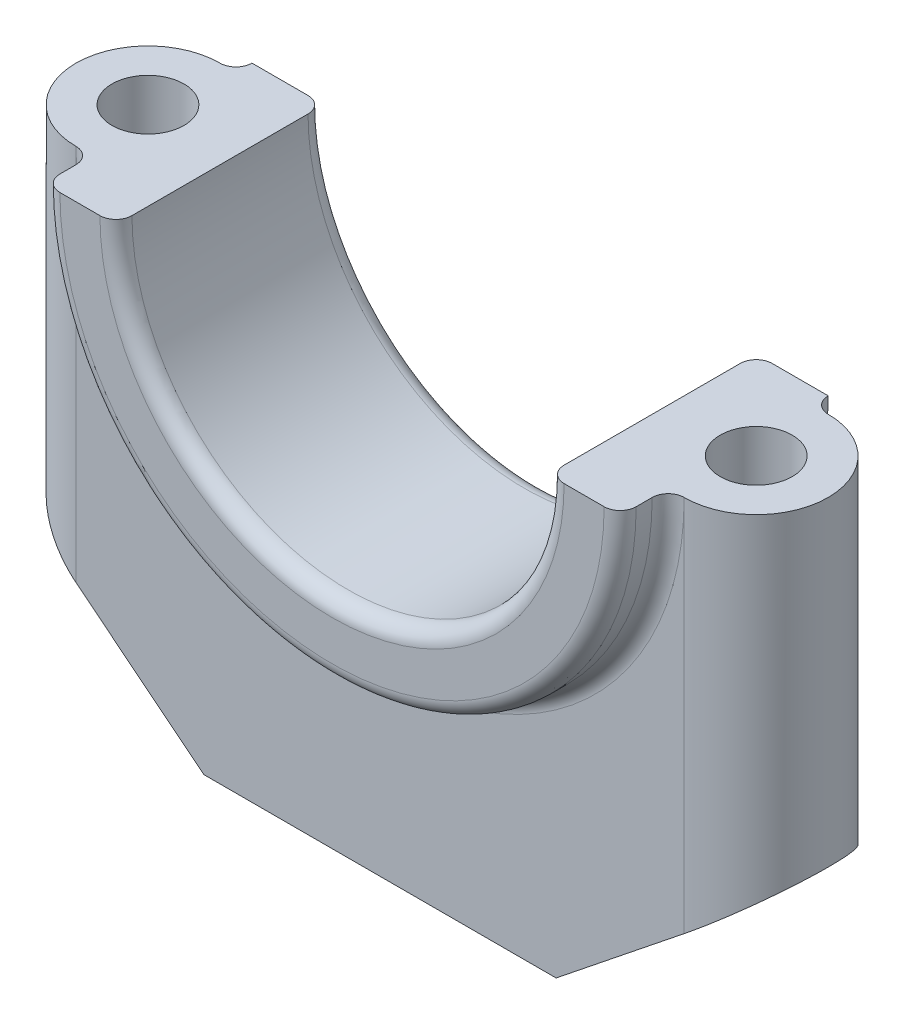
ISO-10303-21;
HEADER;
FILE_DESCRIPTION(('STEP AP214'),'2;1');
FILE_NAME('part.step','',(''),(''),'','','');
FILE_SCHEMA(('AUTOMOTIVE_DESIGN { 1 0 10303 214 1 1 1 1 }'));
ENDSEC;
DATA;
#1=APPLICATION_CONTEXT('core data for automotive mechanical design processes');
#2=APPLICATION_PROTOCOL_DEFINITION('international standard','automotive_design',2000,#1);
#3=PRODUCT_CONTEXT('',#1,'mechanical');
#4=PRODUCT('Part','Part','',(#3));
#5=PRODUCT_RELATED_PRODUCT_CATEGORY('part','',(#4));
#6=PRODUCT_DEFINITION_FORMATION('','',#4);
#7=PRODUCT_DEFINITION_CONTEXT('part definition',#1,'design');
#8=PRODUCT_DEFINITION('design','',#6,#7);
#9=PRODUCT_DEFINITION_SHAPE('','',#8);
#10=(LENGTH_UNIT() NAMED_UNIT(*) SI_UNIT(.MILLI.,.METRE.));
#11=(NAMED_UNIT(*) PLANE_ANGLE_UNIT() SI_UNIT($,.RADIAN.));
#12=(NAMED_UNIT(*) SI_UNIT($,.STERADIAN.) SOLID_ANGLE_UNIT());
#13=UNCERTAINTY_MEASURE_WITH_UNIT(LENGTH_MEASURE(1.E-05),#10,'distance_accuracy_value','');
#14=(GEOMETRIC_REPRESENTATION_CONTEXT(3) GLOBAL_UNCERTAINTY_ASSIGNED_CONTEXT((#13)) GLOBAL_UNIT_ASSIGNED_CONTEXT((#10,
#11,#12)) REPRESENTATION_CONTEXT('',''));
#15=CARTESIAN_POINT('',(0.,0.,0.));
#16=DIRECTION('',(0.,0.,1.));
#17=DIRECTION('',(1.,0.,0.));
#18=AXIS2_PLACEMENT_3D('',#15,#16,#17);
#19=CARTESIAN_POINT('',(-38.,0.,0.));
#20=DIRECTION('',(0.,-1.,0.));
#21=DIRECTION('',(1.,0.,0.));
#22=AXIS2_PLACEMENT_3D('',#19,#20,#21);
#23=CYLINDRICAL_SURFACE('',#22,9.);
#24=DIRECTION('',(0.,1.,0.));
#25=VECTOR('',#24,1.);
#26=CARTESIAN_POINT('',(-38.,0.,9.));
#27=LINE('',#26,#25);
#28=CARTESIAN_POINT('',(-38.,0.,9.));
#29=VERTEX_POINT('',#28);
#30=CARTESIAN_POINT('',(-38.,-47.2,9.));
#31=VERTEX_POINT('',#30);
#32=EDGE_CURVE('E154',#29,#31,#27,.F.);
#33=ORIENTED_EDGE('',*,*,#32,.F.);
#34=CARTESIAN_POINT('',(-38.,0.,0.));
#35=DIRECTION('',(0.,-1.,0.));
#36=DIRECTION('',(0.,0.,-1.));
#37=AXIS2_PLACEMENT_3D('',#34,#35,#36);
#38=CIRCLE('',#37,9.);
#39=CARTESIAN_POINT('',(-38.,0.,-9.));
#40=VERTEX_POINT('',#39);
#41=EDGE_CURVE('E216',#40,#29,#38,.F.);
#42=ORIENTED_EDGE('',*,*,#41,.F.);
#43=DIRECTION('',(0.,-1.,0.));
#44=VECTOR('',#43,1.);
#45=CARTESIAN_POINT('',(-38.,0.,-9.));
#46=LINE('',#45,#44);
#47=CARTESIAN_POINT('',(-38.,-47.2,-9.));
#48=VERTEX_POINT('',#47);
#49=EDGE_CURVE('E213',#48,#40,#46,.F.);
#50=ORIENTED_EDGE('',*,*,#49,.F.);
#51=CARTESIAN_POINT('',(-38.,-47.2,0.));
#52=DIRECTION('',(0.624695047554424,0.78086880944303,0.));
#53=DIRECTION('',(0.78086880944303,-0.624695047554424,0.));
#54=AXIS2_PLACEMENT_3D('',#51,#52,#53);
#55=ELLIPSE('',#54,11.5256236273791,9.);
#56=EDGE_CURVE('E219',#31,#48,#55,.F.);
#57=ORIENTED_EDGE('',*,*,#56,.F.);
#58=EDGE_LOOP('',(#33,#42,#50,#57));
#59=FACE_BOUND('',#58,.T.);
#60=ADVANCED_FACE('F40',(#59),#23,.T.);
#61=CARTESIAN_POINT('',(38.,0.,0.));
#62=DIRECTION('',(0.,-1.,0.));
#63=DIRECTION('',(1.,0.,0.));
#64=AXIS2_PLACEMENT_3D('',#61,#62,#63);
#65=CYLINDRICAL_SURFACE('',#64,9.);
#66=DIRECTION('',(0.,1.,0.));
#67=VECTOR('',#66,1.);
#68=CARTESIAN_POINT('',(38.,0.,-9.));
#69=LINE('',#68,#67);
#70=CARTESIAN_POINT('',(38.,0.,-9.));
#71=VERTEX_POINT('',#70);
#72=CARTESIAN_POINT('',(38.,-47.2,-9.));
#73=VERTEX_POINT('',#72);
#74=EDGE_CURVE('E193',#71,#73,#69,.F.);
#75=ORIENTED_EDGE('',*,*,#74,.F.);
#76=CARTESIAN_POINT('',(38.,0.,0.));
#77=DIRECTION('',(0.,-1.,0.));
#78=DIRECTION('',(0.,0.,-1.));
#79=AXIS2_PLACEMENT_3D('',#76,#77,#78);
#80=CIRCLE('',#79,9.);
#81=CARTESIAN_POINT('',(38.,0.,9.));
#82=VERTEX_POINT('',#81);
#83=EDGE_CURVE('E207',#82,#71,#80,.F.);
#84=ORIENTED_EDGE('',*,*,#83,.F.);
#85=DIRECTION('',(0.,-1.,0.));
#86=VECTOR('',#85,1.);
#87=CARTESIAN_POINT('',(38.,0.,9.));
#88=LINE('',#87,#86);
#89=CARTESIAN_POINT('',(38.,-47.2,9.));
#90=VERTEX_POINT('',#89);
#91=EDGE_CURVE('E205',#90,#82,#88,.F.);
#92=ORIENTED_EDGE('',*,*,#91,.F.);
#93=CARTESIAN_POINT('',(38.,-47.2,0.));
#94=DIRECTION('',(0.624695047554424,-0.78086880944303,0.));
#95=DIRECTION('',(-0.78086880944303,-0.624695047554424,0.));
#96=AXIS2_PLACEMENT_3D('',#93,#94,#95);
#97=ELLIPSE('',#96,11.5256236273791,9.);
#98=EDGE_CURVE('E210',#73,#90,#97,.T.);
#99=ORIENTED_EDGE('',*,*,#98,.F.);
#100=EDGE_LOOP('',(#75,#84,#92,#99));
#101=FACE_BOUND('',#100,.T.);
#102=ADVANCED_FACE('F294',(#101),#65,.T.);
#103=CARTESIAN_POINT('',(0.,0.,-11.));
#104=DIRECTION('',(0.,-1.,0.));
#105=DIRECTION('',(0.,0.,-1.));
#106=AXIS2_PLACEMENT_3D('',#103,#104,#105);
#107=PLANE('',#106);
#108=CARTESIAN_POINT('',(-38.,0.,0.));
#109=DIRECTION('',(0.,1.,0.));
#110=DIRECTION('',(0.,0.,-1.));
#111=AXIS2_PLACEMENT_3D('',#108,#109,#110);
#112=CIRCLE('',#111,4.5);
#113=CARTESIAN_POINT('',(-38.,0.,-4.5));
#114=VERTEX_POINT('',#113);
#115=EDGE_CURVE('E485',#114,#114,#112,.T.);
#116=ORIENTED_EDGE('',*,*,#115,.F.);
#117=EDGE_LOOP('',(#116));
#118=FACE_BOUND('',#117,.T.);
#119=DIRECTION('',(1.,0.,0.));
#120=VECTOR('',#119,1.);
#121=CARTESIAN_POINT('',(0.,0.,15.));
#122=LINE('',#121,#120);
#123=CARTESIAN_POINT('',(-34.,0.,15.));
#124=VERTEX_POINT('',#123);
#125=CARTESIAN_POINT('',(-29.,0.,15.));
#126=VERTEX_POINT('',#125);
#127=EDGE_CURVE('E166',#124,#126,#122,.T.);
#128=ORIENTED_EDGE('',*,*,#127,.T.);
#129=CARTESIAN_POINT('',(-29.,0.,13.));
#130=DIRECTION('',(0.,-1.,0.));
#131=DIRECTION('',(0.,0.,-1.));
#132=AXIS2_PLACEMENT_3D('',#129,#130,#131);
#133=CIRCLE('',#132,2.);
#134=CARTESIAN_POINT('',(-27.,0.,13.));
#135=VERTEX_POINT('',#134);
#136=EDGE_CURVE('E48',#126,#135,#133,.F.);
#137=ORIENTED_EDGE('',*,*,#136,.T.);
#138=DIRECTION('',(0.,0.,1.));
#139=VECTOR('',#138,1.);
#140=CARTESIAN_POINT('',(-27.,0.,-11.));
#141=LINE('',#140,#139);
#142=CARTESIAN_POINT('',(-27.,0.,-9.));
#143=VERTEX_POINT('',#142);
#144=EDGE_CURVE('E190',#143,#135,#141,.T.);
#145=ORIENTED_EDGE('',*,*,#144,.F.);
#146=CARTESIAN_POINT('',(-29.,0.,-9.));
#147=DIRECTION('',(0.,-1.,0.));
#148=DIRECTION('',(0.,0.,-1.));
#149=AXIS2_PLACEMENT_3D('',#146,#147,#148);
#150=CIRCLE('',#149,2.);
#151=CARTESIAN_POINT('',(-29.,0.,-11.));
#152=VERTEX_POINT('',#151);
#153=EDGE_CURVE('E55',#143,#152,#150,.F.);
#154=ORIENTED_EDGE('',*,*,#153,.T.);
#155=DIRECTION('',(1.,0.,0.));
#156=VECTOR('',#155,1.);
#157=CARTESIAN_POINT('',(0.,0.,-11.));
#158=LINE('',#157,#156);
#159=CARTESIAN_POINT('',(-36.,0.,-11.));
#160=VERTEX_POINT('',#159);
#161=EDGE_CURVE('E184',#160,#152,#158,.T.);
#162=ORIENTED_EDGE('',*,*,#161,.F.);
#163=CARTESIAN_POINT('',(-38.,0.,-11.));
#164=DIRECTION('',(0.,-1.,0.));
#165=DIRECTION('',(0.,0.,-1.));
#166=AXIS2_PLACEMENT_3D('',#163,#164,#165);
#167=CIRCLE('',#166,2.);
#168=EDGE_CURVE('E247',#160,#40,#167,.T.);
#169=ORIENTED_EDGE('',*,*,#168,.T.);
#170=ORIENTED_EDGE('',*,*,#41,.T.);
#171=CARTESIAN_POINT('',(-38.,0.,11.));
#172=DIRECTION('',(0.,-1.,0.));
#173=DIRECTION('',(0.,0.,-1.));
#174=AXIS2_PLACEMENT_3D('',#171,#172,#173);
#175=CIRCLE('',#174,2.);
#176=CARTESIAN_POINT('',(-36.,0.,11.));
#177=VERTEX_POINT('',#176);
#178=EDGE_CURVE('E251',#29,#177,#175,.T.);
#179=ORIENTED_EDGE('',*,*,#178,.T.);
#180=DIRECTION('',(0.,0.,1.));
#181=VECTOR('',#180,1.);
#182=CARTESIAN_POINT('',(-36.,0.,-11.));
#183=LINE('',#182,#181);
#184=CARTESIAN_POINT('',(-36.,0.,13.));
#185=VERTEX_POINT('',#184);
#186=EDGE_CURVE('E200',#177,#185,#183,.T.);
#187=ORIENTED_EDGE('',*,*,#186,.T.);
#188=CARTESIAN_POINT('',(-34.,0.,13.));
#189=DIRECTION('',(0.,-1.,0.));
#190=DIRECTION('',(0.,0.,-1.));
#191=AXIS2_PLACEMENT_3D('',#188,#189,#190);
#192=CIRCLE('',#191,2.);
#193=EDGE_CURVE('E237',#185,#124,#192,.F.);
#194=ORIENTED_EDGE('',*,*,#193,.T.);
#195=EDGE_LOOP('',(#128,#137,#145,#154,#162,#169,#170,#179,#187,#194));
#196=FACE_BOUND('',#195,.T.);
#197=ADVANCED_FACE('F264',(#118,#196),#107,.F.);
#198=CARTESIAN_POINT('',(0.,0.,-11.));
#199=DIRECTION('',(0.,0.,1.));
#200=DIRECTION('',(1.,0.,0.));
#201=AXIS2_PLACEMENT_3D('',#198,#199,#200);
#202=CYLINDRICAL_SURFACE('',#201,27.);
#203=ORIENTED_EDGE('',*,*,#144,.T.);
#204=CARTESIAN_POINT('',(0.,0.,13.));
#205=DIRECTION('',(0.,0.,1.));
#206=DIRECTION('',(1.,0.,0.));
#207=AXIS2_PLACEMENT_3D('',#204,#205,#206);
#208=CIRCLE('',#207,27.);
#209=CARTESIAN_POINT('',(27.,0.,13.));
#210=VERTEX_POINT('',#209);
#211=EDGE_CURVE('E255',#135,#210,#208,.T.);
#212=ORIENTED_EDGE('',*,*,#211,.T.);
#213=DIRECTION('',(0.,0.,1.));
#214=VECTOR('',#213,1.);
#215=CARTESIAN_POINT('',(27.,0.,-11.));
#216=LINE('',#215,#214);
#217=CARTESIAN_POINT('',(27.,0.,-9.));
#218=VERTEX_POINT('',#217);
#219=EDGE_CURVE('E194',#218,#210,#216,.T.);
#220=ORIENTED_EDGE('',*,*,#219,.F.);
#221=CARTESIAN_POINT('',(0.,0.,-9.));
#222=DIRECTION('',(0.,0.,1.));
#223=DIRECTION('',(1.,0.,0.));
#224=AXIS2_PLACEMENT_3D('',#221,#222,#223);
#225=CIRCLE('',#224,27.);
#226=EDGE_CURVE('E253',#218,#143,#225,.F.);
#227=ORIENTED_EDGE('',*,*,#226,.T.);
#228=EDGE_LOOP('',(#203,#212,#220,#227));
#229=FACE_BOUND('',#228,.T.);
#230=ADVANCED_FACE('F268',(#229),#202,.F.);
#231=CARTESIAN_POINT('',(38.,0.,0.));
#232=DIRECTION('',(0.,1.,0.));
#233=DIRECTION('',(0.,0.,1.));
#234=AXIS2_PLACEMENT_3D('',#231,#232,#233);
#235=CIRCLE('',#234,4.5);
#236=CARTESIAN_POINT('',(38.,0.,4.5));
#237=VERTEX_POINT('',#236);
#238=EDGE_CURVE('E225',#237,#237,#235,.T.);
#239=ORIENTED_EDGE('',*,*,#238,.F.);
#240=EDGE_LOOP('',(#239));
#241=FACE_BOUND('',#240,.T.);
#242=ORIENTED_EDGE('',*,*,#219,.T.);
#243=CARTESIAN_POINT('',(29.,0.,13.));
#244=DIRECTION('',(0.,-1.,0.));
#245=DIRECTION('',(0.,0.,-1.));
#246=AXIS2_PLACEMENT_3D('',#243,#244,#245);
#247=CIRCLE('',#246,2.);
#248=CARTESIAN_POINT('',(29.,0.,15.));
#249=VERTEX_POINT('',#248);
#250=EDGE_CURVE('E260',#210,#249,#247,.F.);
#251=ORIENTED_EDGE('',*,*,#250,.T.);
#252=CARTESIAN_POINT('',(34.,0.,15.));
#253=VERTEX_POINT('',#252);
#254=EDGE_CURVE('E183',#249,#253,#122,.T.);
#255=ORIENTED_EDGE('',*,*,#254,.T.);
#256=CARTESIAN_POINT('',(34.,0.,13.));
#257=DIRECTION('',(0.,-1.,0.));
#258=DIRECTION('',(0.,0.,-1.));
#259=AXIS2_PLACEMENT_3D('',#256,#257,#258);
#260=CIRCLE('',#259,2.);
#261=CARTESIAN_POINT('',(36.,0.,13.));
#262=VERTEX_POINT('',#261);
#263=EDGE_CURVE('E230',#253,#262,#260,.F.);
#264=ORIENTED_EDGE('',*,*,#263,.T.);
#265=DIRECTION('',(0.,0.,1.));
#266=VECTOR('',#265,1.);
#267=CARTESIAN_POINT('',(36.,0.,-11.));
#268=LINE('',#267,#266);
#269=CARTESIAN_POINT('',(36.,0.,11.));
#270=VERTEX_POINT('',#269);
#271=EDGE_CURVE('E197',#270,#262,#268,.T.);
#272=ORIENTED_EDGE('',*,*,#271,.F.);
#273=CARTESIAN_POINT('',(38.,0.,11.));
#274=DIRECTION('',(0.,-1.,0.));
#275=DIRECTION('',(0.,0.,-1.));
#276=AXIS2_PLACEMENT_3D('',#273,#274,#275);
#277=CIRCLE('',#276,2.);
#278=EDGE_CURVE('E249',#270,#82,#277,.T.);
#279=ORIENTED_EDGE('',*,*,#278,.T.);
#280=ORIENTED_EDGE('',*,*,#83,.T.);
#281=CARTESIAN_POINT('',(38.,0.,-11.));
#282=DIRECTION('',(0.,-1.,0.));
#283=DIRECTION('',(0.,0.,-1.));
#284=AXIS2_PLACEMENT_3D('',#281,#282,#283);
#285=CIRCLE('',#284,2.);
#286=CARTESIAN_POINT('',(36.,0.,-11.));
#287=VERTEX_POINT('',#286);
#288=EDGE_CURVE('E244',#71,#287,#285,.T.);
#289=ORIENTED_EDGE('',*,*,#288,.T.);
#290=CARTESIAN_POINT('',(29.,0.,-11.));
#291=VERTEX_POINT('',#290);
#292=EDGE_CURVE('E187',#291,#287,#158,.T.);
#293=ORIENTED_EDGE('',*,*,#292,.F.);
#294=CARTESIAN_POINT('',(29.,0.,-9.));
#295=DIRECTION('',(0.,-1.,0.));
#296=DIRECTION('',(0.,0.,-1.));
#297=AXIS2_PLACEMENT_3D('',#294,#295,#296);
#298=CIRCLE('',#297,2.);
#299=EDGE_CURVE('E258',#291,#218,#298,.F.);
#300=ORIENTED_EDGE('',*,*,#299,.T.);
#301=EDGE_LOOP('',(#242,#251,#255,#264,#272,#279,#280,#289,#293,#300));
#302=FACE_BOUND('',#301,.T.);
#303=ADVANCED_FACE('F273',(#241,#302),#107,.F.);
#304=CARTESIAN_POINT('',(0.,0.,-11.));
#305=DIRECTION('',(0.,0.,1.));
#306=DIRECTION('',(1.,0.,0.));
#307=AXIS2_PLACEMENT_3D('',#304,#305,#306);
#308=CYLINDRICAL_SURFACE('',#307,36.);
#309=ORIENTED_EDGE('',*,*,#271,.T.);
#310=CARTESIAN_POINT('',(0.,0.,13.));
#311=DIRECTION('',(0.,0.,1.));
#312=DIRECTION('',(1.,0.,0.));
#313=AXIS2_PLACEMENT_3D('',#310,#311,#312);
#314=CIRCLE('',#313,36.);
#315=EDGE_CURVE('E235',#262,#185,#314,.F.);
#316=ORIENTED_EDGE('',*,*,#315,.T.);
#317=ORIENTED_EDGE('',*,*,#186,.F.);
#318=CARTESIAN_POINT('',(0.,0.,11.));
#319=DIRECTION('',(0.,0.,1.));
#320=DIRECTION('',(1.,0.,0.));
#321=AXIS2_PLACEMENT_3D('',#318,#319,#320);
#322=CIRCLE('',#321,36.);
#323=EDGE_CURVE('E232',#177,#270,#322,.T.);
#324=ORIENTED_EDGE('',*,*,#323,.T.);
#325=EDGE_LOOP('',(#309,#316,#317,#324));
#326=FACE_BOUND('',#325,.T.);
#327=ADVANCED_FACE('F283',(#326),#308,.T.);
#328=CARTESIAN_POINT('',(0.,0.,-11.));
#329=DIRECTION('',(0.,0.,1.));
#330=DIRECTION('',(1.,0.,0.));
#331=AXIS2_PLACEMENT_3D('',#328,#329,#330);
#332=PLANE('',#331);
#333=ORIENTED_EDGE('',*,*,#161,.T.);
#334=CARTESIAN_POINT('',(0.,0.,-11.));
#335=DIRECTION('',(0.,0.,1.));
#336=DIRECTION('',(1.,0.,0.));
#337=AXIS2_PLACEMENT_3D('',#334,#335,#336);
#338=CIRCLE('',#337,29.);
#339=EDGE_CURVE('E11',#152,#291,#338,.T.);
#340=ORIENTED_EDGE('',*,*,#339,.T.);
#341=ORIENTED_EDGE('',*,*,#292,.T.);
#342=CARTESIAN_POINT('',(0.,0.,-11.));
#343=DIRECTION('',(0.,0.,1.));
#344=DIRECTION('',(1.,0.,0.));
#345=AXIS2_PLACEMENT_3D('',#342,#343,#344);
#346=CIRCLE('',#345,36.);
#347=EDGE_CURVE('E186',#160,#287,#346,.T.);
#348=ORIENTED_EDGE('',*,*,#347,.F.);
#349=EDGE_LOOP('',(#333,#340,#341,#348));
#350=FACE_BOUND('',#349,.T.);
#351=ADVANCED_FACE('F308',(#350),#332,.F.);
#352=CARTESIAN_POINT('',(0.,0.,15.));
#353=DIRECTION('',(0.,0.,1.));
#354=DIRECTION('',(1.,0.,0.));
#355=AXIS2_PLACEMENT_3D('',#352,#353,#354);
#356=PLANE('',#355);
#357=ORIENTED_EDGE('',*,*,#254,.F.);
#358=CARTESIAN_POINT('',(0.,0.,15.));
#359=DIRECTION('',(0.,0.,1.));
#360=DIRECTION('',(1.,0.,0.));
#361=AXIS2_PLACEMENT_3D('',#358,#359,#360);
#362=CIRCLE('',#361,29.);
#363=EDGE_CURVE('E63',#249,#126,#362,.F.);
#364=ORIENTED_EDGE('',*,*,#363,.T.);
#365=ORIENTED_EDGE('',*,*,#127,.F.);
#366=CARTESIAN_POINT('',(0.,0.,15.));
#367=DIRECTION('',(0.,0.,1.));
#368=DIRECTION('',(1.,0.,0.));
#369=AXIS2_PLACEMENT_3D('',#366,#367,#368);
#370=CIRCLE('',#369,34.);
#371=EDGE_CURVE('E221',#124,#253,#370,.T.);
#372=ORIENTED_EDGE('',*,*,#371,.T.);
#373=EDGE_LOOP('',(#357,#364,#365,#372));
#374=FACE_BOUND('',#373,.T.);
#375=ADVANCED_FACE('F275',(#374),#356,.T.);
#376=CARTESIAN_POINT('',(-37.8536585365854,-47.3170731707317,9.));
#377=DIRECTION('',(0.624695047554424,0.78086880944303,0.));
#378=DIRECTION('',(-0.78086880944303,0.624695047554424,0.));
#379=AXIS2_PLACEMENT_3D('',#376,#377,#378);
#380=PLANE('',#379);
#381=CARTESIAN_POINT('',(-38.,-47.2,0.));
#382=DIRECTION('',(0.624695047554424,0.78086880944303,0.));
#383=DIRECTION('',(-0.78086880944303,0.624695047554424,0.));
#384=AXIS2_PLACEMENT_3D('',#381,#382,#383);
#385=ELLIPSE('',#384,5.76281181368956,4.5);
#386=CARTESIAN_POINT('',(-42.5,-43.6,0.));
#387=VERTEX_POINT('',#386);
#388=EDGE_CURVE('E178',#387,#387,#385,.T.);
#389=ORIENTED_EDGE('',*,*,#388,.T.);
#390=EDGE_LOOP('',(#389));
#391=FACE_BOUND('',#390,.T.);
#392=DIRECTION('',(0.78086880944303,-0.624695047554424,0.));
#393=VECTOR('',#392,1.);
#394=CARTESIAN_POINT('',(-37.8536585365854,-47.3170731707317,9.));
#395=LINE('',#394,#393);
#396=CARTESIAN_POINT('',(-22.,-60.,9.));
#397=VERTEX_POINT('',#396);
#398=EDGE_CURVE('E145',#31,#397,#395,.T.);
#399=ORIENTED_EDGE('',*,*,#398,.F.);
#400=ORIENTED_EDGE('',*,*,#56,.T.);
#401=DIRECTION('',(0.78086880944303,-0.624695047554424,0.));
#402=VECTOR('',#401,1.);
#403=CARTESIAN_POINT('',(-37.8536585365854,-47.3170731707317,-9.));
#404=LINE('',#403,#402);
#405=CARTESIAN_POINT('',(-22.,-60.,-9.));
#406=VERTEX_POINT('',#405);
#407=EDGE_CURVE('E162',#48,#406,#404,.T.);
#408=ORIENTED_EDGE('',*,*,#407,.T.);
#409=DIRECTION('',(0.,0.,-1.));
#410=VECTOR('',#409,1.);
#411=CARTESIAN_POINT('',(-22.,-60.,9.));
#412=LINE('',#411,#410);
#413=EDGE_CURVE('E159',#397,#406,#412,.T.);
#414=ORIENTED_EDGE('',*,*,#413,.F.);
#415=EDGE_LOOP('',(#399,#400,#408,#414));
#416=FACE_BOUND('',#415,.T.);
#417=ADVANCED_FACE('F160',(#391,#416),#380,.F.);
#418=CARTESIAN_POINT('',(0.,-60.,9.));
#419=DIRECTION('',(0.,1.,0.));
#420=DIRECTION('',(0.,0.,1.));
#421=AXIS2_PLACEMENT_3D('',#418,#419,#420);
#422=PLANE('',#421);
#423=DIRECTION('',(1.,0.,0.));
#424=VECTOR('',#423,1.);
#425=CARTESIAN_POINT('',(0.,-60.,-9.));
#426=LINE('',#425,#424);
#427=CARTESIAN_POINT('',(22.,-60.,-9.));
#428=VERTEX_POINT('',#427);
#429=EDGE_CURVE('E177',#406,#428,#426,.T.);
#430=ORIENTED_EDGE('',*,*,#429,.T.);
#431=DIRECTION('',(0.,0.,-1.));
#432=VECTOR('',#431,1.);
#433=CARTESIAN_POINT('',(22.,-60.,9.));
#434=LINE('',#433,#432);
#435=CARTESIAN_POINT('',(22.,-60.,9.));
#436=VERTEX_POINT('',#435);
#437=EDGE_CURVE('E167',#436,#428,#434,.T.);
#438=ORIENTED_EDGE('',*,*,#437,.F.);
#439=DIRECTION('',(1.,0.,0.));
#440=VECTOR('',#439,1.);
#441=CARTESIAN_POINT('',(0.,-60.,9.));
#442=LINE('',#441,#440);
#443=EDGE_CURVE('E151',#397,#436,#442,.T.);
#444=ORIENTED_EDGE('',*,*,#443,.F.);
#445=ORIENTED_EDGE('',*,*,#413,.T.);
#446=EDGE_LOOP('',(#430,#438,#444,#445));
#447=FACE_BOUND('',#446,.T.);
#448=ADVANCED_FACE('F169',(#447),#422,.F.);
#449=CARTESIAN_POINT('',(37.8536585365854,-47.3170731707317,9.));
#450=DIRECTION('',(0.624695047554424,-0.78086880944303,0.));
#451=DIRECTION('',(0.78086880944303,0.624695047554424,0.));
#452=AXIS2_PLACEMENT_3D('',#449,#450,#451);
#453=PLANE('',#452);
#454=CARTESIAN_POINT('',(38.,-47.2,0.));
#455=DIRECTION('',(0.624695047554424,-0.78086880944303,0.));
#456=DIRECTION('',(0.78086880944303,0.624695047554424,0.));
#457=AXIS2_PLACEMENT_3D('',#454,#455,#456);
#458=ELLIPSE('',#457,5.76281181368956,4.5);
#459=CARTESIAN_POINT('',(42.5,-43.6,0.));
#460=VERTEX_POINT('',#459);
#461=EDGE_CURVE('E222',#460,#460,#458,.T.);
#462=ORIENTED_EDGE('',*,*,#461,.F.);
#463=EDGE_LOOP('',(#462));
#464=FACE_BOUND('',#463,.T.);
#465=DIRECTION('',(-0.78086880944303,-0.624695047554424,0.));
#466=VECTOR('',#465,1.);
#467=CARTESIAN_POINT('',(37.8536585365854,-47.3170731707317,-9.));
#468=LINE('',#467,#466);
#469=EDGE_CURVE('E156',#73,#428,#468,.T.);
#470=ORIENTED_EDGE('',*,*,#469,.F.);
#471=ORIENTED_EDGE('',*,*,#98,.T.);
#472=DIRECTION('',(-0.78086880944303,-0.624695047554424,0.));
#473=VECTOR('',#472,1.);
#474=CARTESIAN_POINT('',(37.8536585365854,-47.3170731707317,9.));
#475=LINE('',#474,#473);
#476=EDGE_CURVE('E171',#90,#436,#475,.T.);
#477=ORIENTED_EDGE('',*,*,#476,.T.);
#478=ORIENTED_EDGE('',*,*,#437,.T.);
#479=EDGE_LOOP('',(#470,#471,#477,#478));
#480=FACE_BOUND('',#479,.T.);
#481=ADVANCED_FACE('F297',(#464,#480),#453,.T.);
#482=CARTESIAN_POINT('',(0.,0.,9.));
#483=DIRECTION('',(0.,0.,1.));
#484=DIRECTION('',(1.,0.,0.));
#485=AXIS2_PLACEMENT_3D('',#482,#483,#484);
#486=PLANE('',#485);
#487=ORIENTED_EDGE('',*,*,#91,.T.);
#488=CARTESIAN_POINT('',(0.,0.,9.));
#489=DIRECTION('',(0.,0.,1.));
#490=DIRECTION('',(1.,0.,0.));
#491=AXIS2_PLACEMENT_3D('',#488,#489,#490);
#492=CIRCLE('',#491,38.);
#493=EDGE_CURVE('E242',#82,#29,#492,.F.);
#494=ORIENTED_EDGE('',*,*,#493,.T.);
#495=ORIENTED_EDGE('',*,*,#32,.T.);
#496=ORIENTED_EDGE('',*,*,#398,.T.);
#497=ORIENTED_EDGE('',*,*,#443,.T.);
#498=ORIENTED_EDGE('',*,*,#476,.F.);
#499=EDGE_LOOP('',(#487,#494,#495,#496,#497,#498));
#500=FACE_BOUND('',#499,.T.);
#501=ADVANCED_FACE('F148',(#500),#486,.T.);
#502=CARTESIAN_POINT('',(0.,0.,-9.));
#503=DIRECTION('',(0.,0.,1.));
#504=DIRECTION('',(1.,0.,0.));
#505=AXIS2_PLACEMENT_3D('',#502,#503,#504);
#506=PLANE('',#505);
#507=ORIENTED_EDGE('',*,*,#49,.T.);
#508=CARTESIAN_POINT('',(0.,0.,-9.));
#509=DIRECTION('',(0.,0.,1.));
#510=DIRECTION('',(1.,0.,0.));
#511=AXIS2_PLACEMENT_3D('',#508,#509,#510);
#512=CIRCLE('',#511,38.);
#513=EDGE_CURVE('E239',#40,#71,#512,.T.);
#514=ORIENTED_EDGE('',*,*,#513,.T.);
#515=ORIENTED_EDGE('',*,*,#74,.T.);
#516=ORIENTED_EDGE('',*,*,#469,.T.);
#517=ORIENTED_EDGE('',*,*,#429,.F.);
#518=ORIENTED_EDGE('',*,*,#407,.F.);
#519=EDGE_LOOP('',(#507,#514,#515,#516,#517,#518));
#520=FACE_BOUND('',#519,.T.);
#521=ADVANCED_FACE('F299',(#520),#506,.F.);
#522=CARTESIAN_POINT('',(38.,-88.,0.));
#523=DIRECTION('',(0.,1.,0.));
#524=DIRECTION('',(0.,0.,1.));
#525=AXIS2_PLACEMENT_3D('',#522,#523,#524);
#526=CYLINDRICAL_SURFACE('',#525,4.5);
#527=ORIENTED_EDGE('',*,*,#461,.T.);
#528=EDGE_LOOP('',(#527));
#529=FACE_BOUND('',#528,.T.);
#530=ORIENTED_EDGE('',*,*,#238,.T.);
#531=EDGE_LOOP('',(#530));
#532=FACE_BOUND('',#531,.T.);
#533=ADVANCED_FACE('F426',(#529,#532),#526,.F.);
#534=CARTESIAN_POINT('',(-38.,-88.,0.));
#535=DIRECTION('',(0.,1.,0.));
#536=DIRECTION('',(0.,0.,1.));
#537=AXIS2_PLACEMENT_3D('',#534,#535,#536);
#538=CYLINDRICAL_SURFACE('',#537,4.5);
#539=ORIENTED_EDGE('',*,*,#115,.T.);
#540=EDGE_LOOP('',(#539));
#541=FACE_BOUND('',#540,.T.);
#542=ORIENTED_EDGE('',*,*,#388,.F.);
#543=EDGE_LOOP('',(#542));
#544=FACE_BOUND('',#543,.T.);
#545=ADVANCED_FACE('F330',(#541,#544),#538,.F.);
#546=CARTESIAN_POINT('',(0.,0.,13.));
#547=DIRECTION('',(0.,0.,1.));
#548=DIRECTION('',(1.,0.,0.));
#549=AXIS2_PLACEMENT_3D('',#546,#547,#548);
#550=TOROIDAL_SURFACE('',#549,34.,2.);
#551=ORIENTED_EDGE('',*,*,#193,.F.);
#552=ORIENTED_EDGE('',*,*,#315,.F.);
#553=ORIENTED_EDGE('',*,*,#263,.F.);
#554=ORIENTED_EDGE('',*,*,#371,.F.);
#555=EDGE_LOOP('',(#551,#552,#553,#554));
#556=FACE_BOUND('',#555,.T.);
#557=ADVANCED_FACE('F279',(#556),#550,.T.);
#558=CARTESIAN_POINT('',(0.,0.,-11.));
#559=DIRECTION('',(0.,0.,1.));
#560=DIRECTION('',(1.,0.,0.));
#561=AXIS2_PLACEMENT_3D('',#558,#559,#560);
#562=TOROIDAL_SURFACE('',#561,38.,2.);
#563=ORIENTED_EDGE('',*,*,#168,.F.);
#564=ORIENTED_EDGE('',*,*,#347,.T.);
#565=ORIENTED_EDGE('',*,*,#288,.F.);
#566=ORIENTED_EDGE('',*,*,#513,.F.);
#567=EDGE_LOOP('',(#563,#564,#565,#566));
#568=FACE_BOUND('',#567,.T.);
#569=ADVANCED_FACE('F304',(#568),#562,.F.);
#570=CARTESIAN_POINT('',(0.,0.,11.));
#571=DIRECTION('',(0.,0.,1.));
#572=DIRECTION('',(1.,0.,0.));
#573=AXIS2_PLACEMENT_3D('',#570,#571,#572);
#574=TOROIDAL_SURFACE('',#573,38.,2.);
#575=ORIENTED_EDGE('',*,*,#178,.F.);
#576=ORIENTED_EDGE('',*,*,#493,.F.);
#577=ORIENTED_EDGE('',*,*,#278,.F.);
#578=ORIENTED_EDGE('',*,*,#323,.F.);
#579=EDGE_LOOP('',(#575,#576,#577,#578));
#580=FACE_BOUND('',#579,.T.);
#581=ADVANCED_FACE('F288',(#580),#574,.F.);
#582=CARTESIAN_POINT('',(0.,0.,13.));
#583=DIRECTION('',(0.,0.,1.));
#584=DIRECTION('',(1.,0.,0.));
#585=AXIS2_PLACEMENT_3D('',#582,#583,#584);
#586=TOROIDAL_SURFACE('',#585,29.,2.);
#587=ORIENTED_EDGE('',*,*,#136,.F.);
#588=ORIENTED_EDGE('',*,*,#363,.F.);
#589=ORIENTED_EDGE('',*,*,#250,.F.);
#590=ORIENTED_EDGE('',*,*,#211,.F.);
#591=EDGE_LOOP('',(#587,#588,#589,#590));
#592=FACE_BOUND('',#591,.T.);
#593=ADVANCED_FACE('F271',(#592),#586,.T.);
#594=CARTESIAN_POINT('',(0.,0.,-9.));
#595=DIRECTION('',(0.,0.,1.));
#596=DIRECTION('',(1.,0.,0.));
#597=AXIS2_PLACEMENT_3D('',#594,#595,#596);
#598=TOROIDAL_SURFACE('',#597,29.,2.);
#599=ORIENTED_EDGE('',*,*,#153,.F.);
#600=ORIENTED_EDGE('',*,*,#226,.F.);
#601=ORIENTED_EDGE('',*,*,#299,.F.);
#602=ORIENTED_EDGE('',*,*,#339,.F.);
#603=EDGE_LOOP('',(#599,#600,#601,#602));
#604=FACE_BOUND('',#603,.T.);
#605=ADVANCED_FACE('F42',(#604),#598,.T.);
#606=CLOSED_SHELL('',(#60,#102,#197,#230,#303,#327,#351,#375,#417,#448,#481,#501,#521,#533,#545,
#557,#569,#581,#593,#605));
#607=MANIFOLD_SOLID_BREP('B2',#606);
#608=ADVANCED_BREP_SHAPE_REPRESENTATION('',(#18,#607),#14);
#609=SHAPE_DEFINITION_REPRESENTATION(#9,#608);
ENDSEC;
END-ISO-10303-21;
